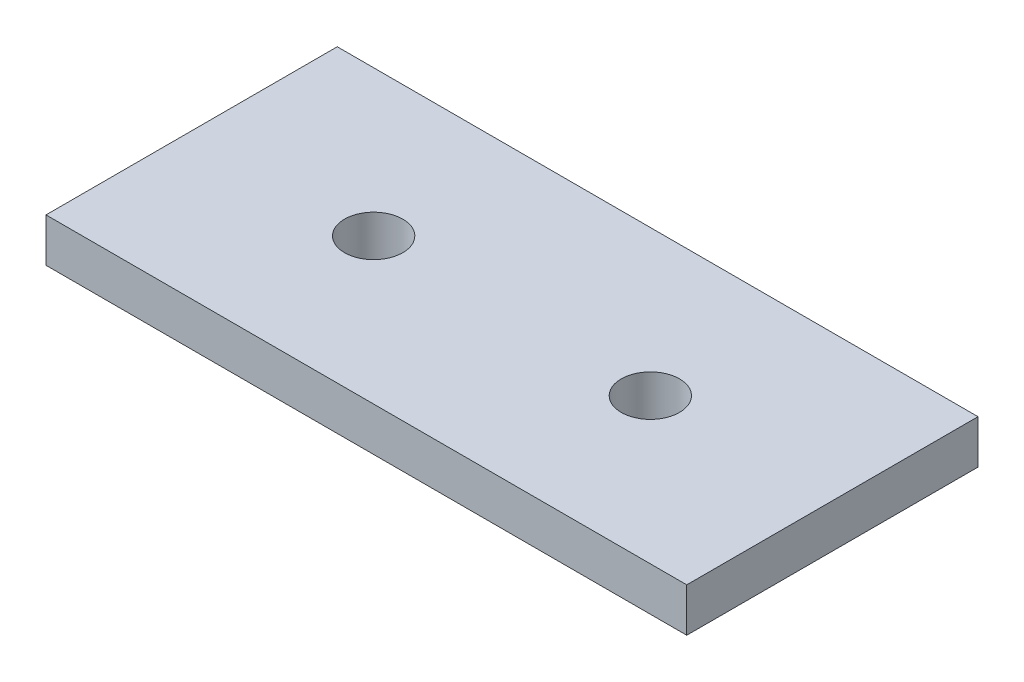
ISO-10303-21;
HEADER;
FILE_DESCRIPTION(('STEP AP214'),'2;1');
FILE_NAME('part.step','',(''),(''),'','','');
FILE_SCHEMA(('AUTOMOTIVE_DESIGN { 1 0 10303 214 1 1 1 1 }'));
ENDSEC;
DATA;
#1=APPLICATION_CONTEXT('core data for automotive mechanical design processes');
#2=APPLICATION_PROTOCOL_DEFINITION('international standard','automotive_design',2000,#1);
#3=PRODUCT_CONTEXT('',#1,'mechanical');
#4=PRODUCT('Part','Part','',(#3));
#5=PRODUCT_RELATED_PRODUCT_CATEGORY('part','',(#4));
#6=PRODUCT_DEFINITION_FORMATION('','',#4);
#7=PRODUCT_DEFINITION_CONTEXT('part definition',#1,'design');
#8=PRODUCT_DEFINITION('design','',#6,#7);
#9=PRODUCT_DEFINITION_SHAPE('','',#8);
#10=(LENGTH_UNIT() NAMED_UNIT(*) SI_UNIT(.MILLI.,.METRE.));
#11=(NAMED_UNIT(*) PLANE_ANGLE_UNIT() SI_UNIT($,.RADIAN.));
#12=(NAMED_UNIT(*) SI_UNIT($,.STERADIAN.) SOLID_ANGLE_UNIT());
#13=UNCERTAINTY_MEASURE_WITH_UNIT(LENGTH_MEASURE(1.E-05),#10,'distance_accuracy_value','');
#14=(GEOMETRIC_REPRESENTATION_CONTEXT(3) GLOBAL_UNCERTAINTY_ASSIGNED_CONTEXT((#13)) GLOBAL_UNIT_ASSIGNED_CONTEXT((#10,
#11,#12)) REPRESENTATION_CONTEXT('',''));
#15=CARTESIAN_POINT('',(0.,0.,0.));
#16=DIRECTION('',(0.,0.,1.));
#17=DIRECTION('',(1.,0.,0.));
#18=AXIS2_PLACEMENT_3D('',#15,#16,#17);
#19=CARTESIAN_POINT('',(-137.941176470588,6.,-9.55882352941175));
#20=DIRECTION('',(1.,0.,0.));
#21=DIRECTION('',(0.,0.,-1.));
#22=AXIS2_PLACEMENT_3D('',#19,#20,#21);
#23=PLANE('',#22);
#24=DIRECTION('',(0.,0.,1.));
#25=VECTOR('',#24,1.);
#26=CARTESIAN_POINT('',(-137.941176470588,0.,-9.55882352941175));
#27=LINE('',#26,#25);
#28=CARTESIAN_POINT('',(-137.941176470588,0.,-9.55882352941175));
#29=VERTEX_POINT('',#28);
#30=CARTESIAN_POINT('',(-137.941176470588,0.,30.4411764705882));
#31=VERTEX_POINT('',#30);
#32=EDGE_CURVE('E96',#29,#31,#27,.T.);
#33=ORIENTED_EDGE('',*,*,#32,.T.);
#34=DIRECTION('',(0.,-1.,0.));
#35=VECTOR('',#34,1.);
#36=CARTESIAN_POINT('',(-137.941176470588,6.,30.4411764705882));
#37=LINE('',#36,#35);
#38=CARTESIAN_POINT('',(-137.941176470588,6.,30.4411764705882));
#39=VERTEX_POINT('',#38);
#40=EDGE_CURVE('E11',#39,#31,#37,.T.);
#41=ORIENTED_EDGE('',*,*,#40,.F.);
#42=DIRECTION('',(0.,0.,1.));
#43=VECTOR('',#42,1.);
#44=CARTESIAN_POINT('',(-137.941176470588,6.,-9.55882352941175));
#45=LINE('',#44,#43);
#46=CARTESIAN_POINT('',(-137.941176470588,6.,-9.55882352941175));
#47=VERTEX_POINT('',#46);
#48=EDGE_CURVE('E84',#47,#39,#45,.T.);
#49=ORIENTED_EDGE('',*,*,#48,.F.);
#50=DIRECTION('',(0.,-1.,0.));
#51=VECTOR('',#50,1.);
#52=CARTESIAN_POINT('',(-137.941176470588,6.,-9.55882352941175));
#53=LINE('',#52,#51);
#54=EDGE_CURVE('E92',#47,#29,#53,.T.);
#55=ORIENTED_EDGE('',*,*,#54,.T.);
#56=EDGE_LOOP('',(#33,#41,#49,#55));
#57=FACE_BOUND('',#56,.T.);
#58=ADVANCED_FACE('F33',(#57),#23,.F.);
#59=CARTESIAN_POINT('',(-137.941176470588,6.,30.4411764705882));
#60=DIRECTION('',(0.,0.,-1.));
#61=DIRECTION('',(-1.,0.,0.));
#62=AXIS2_PLACEMENT_3D('',#59,#60,#61);
#63=PLANE('',#62);
#64=DIRECTION('',(1.,0.,0.));
#65=VECTOR('',#64,1.);
#66=CARTESIAN_POINT('',(-137.941176470588,0.,30.4411764705882));
#67=LINE('',#66,#65);
#68=CARTESIAN_POINT('',(-49.9411764705882,0.,30.4411764705883));
#69=VERTEX_POINT('',#68);
#70=EDGE_CURVE('E88',#31,#69,#67,.T.);
#71=ORIENTED_EDGE('',*,*,#70,.T.);
#72=DIRECTION('',(0.,-1.,0.));
#73=VECTOR('',#72,1.);
#74=CARTESIAN_POINT('',(-49.9411764705882,6.,30.4411764705883));
#75=LINE('',#74,#73);
#76=CARTESIAN_POINT('',(-49.9411764705882,6.,30.4411764705883));
#77=VERTEX_POINT('',#76);
#78=EDGE_CURVE('E41',#77,#69,#75,.T.);
#79=ORIENTED_EDGE('',*,*,#78,.F.);
#80=DIRECTION('',(1.,0.,0.));
#81=VECTOR('',#80,1.);
#82=CARTESIAN_POINT('',(-137.941176470588,6.,30.4411764705882));
#83=LINE('',#82,#81);
#84=EDGE_CURVE('E79',#39,#77,#83,.T.);
#85=ORIENTED_EDGE('',*,*,#84,.F.);
#86=ORIENTED_EDGE('',*,*,#40,.T.);
#87=EDGE_LOOP('',(#71,#79,#85,#86));
#88=FACE_BOUND('',#87,.T.);
#89=ADVANCED_FACE('F87',(#88),#63,.F.);
#90=CARTESIAN_POINT('',(-49.9411764705882,6.,-9.55882352941175));
#91=DIRECTION('',(-1.,0.,0.));
#92=DIRECTION('',(0.,0.,1.));
#93=AXIS2_PLACEMENT_3D('',#90,#91,#92);
#94=PLANE('',#93);
#95=DIRECTION('',(0.,0.,-1.));
#96=VECTOR('',#95,1.);
#97=CARTESIAN_POINT('',(-49.9411764705882,0.,-9.55882352941175));
#98=LINE('',#97,#96);
#99=CARTESIAN_POINT('',(-49.9411764705882,0.,-9.55882352941175));
#100=VERTEX_POINT('',#99);
#101=EDGE_CURVE('E66',#69,#100,#98,.T.);
#102=ORIENTED_EDGE('',*,*,#101,.T.);
#103=DIRECTION('',(0.,-1.,0.));
#104=VECTOR('',#103,1.);
#105=CARTESIAN_POINT('',(-49.9411764705882,6.,-9.55882352941175));
#106=LINE('',#105,#104);
#107=CARTESIAN_POINT('',(-49.9411764705882,6.,-9.55882352941175));
#108=VERTEX_POINT('',#107);
#109=EDGE_CURVE('E89',#108,#100,#106,.T.);
#110=ORIENTED_EDGE('',*,*,#109,.F.);
#111=DIRECTION('',(0.,0.,-1.));
#112=VECTOR('',#111,1.);
#113=CARTESIAN_POINT('',(-49.9411764705882,6.,-9.55882352941175));
#114=LINE('',#113,#112);
#115=EDGE_CURVE('E82',#77,#108,#114,.T.);
#116=ORIENTED_EDGE('',*,*,#115,.F.);
#117=ORIENTED_EDGE('',*,*,#78,.T.);
#118=EDGE_LOOP('',(#102,#110,#116,#117));
#119=FACE_BOUND('',#118,.T.);
#120=ADVANCED_FACE('F90',(#119),#94,.F.);
#121=CARTESIAN_POINT('',(-137.941176470588,6.,-9.55882352941175));
#122=DIRECTION('',(0.,0.,1.));
#123=DIRECTION('',(1.,0.,0.));
#124=AXIS2_PLACEMENT_3D('',#121,#122,#123);
#125=PLANE('',#124);
#126=DIRECTION('',(-1.,0.,0.));
#127=VECTOR('',#126,1.);
#128=CARTESIAN_POINT('',(-137.941176470588,0.,-9.55882352941175));
#129=LINE('',#128,#127);
#130=EDGE_CURVE('E72',#100,#29,#129,.T.);
#131=ORIENTED_EDGE('',*,*,#130,.T.);
#132=ORIENTED_EDGE('',*,*,#54,.F.);
#133=DIRECTION('',(-1.,0.,0.));
#134=VECTOR('',#133,1.);
#135=CARTESIAN_POINT('',(-137.941176470588,6.,-9.55882352941175));
#136=LINE('',#135,#134);
#137=EDGE_CURVE('E49',#108,#47,#136,.T.);
#138=ORIENTED_EDGE('',*,*,#137,.F.);
#139=ORIENTED_EDGE('',*,*,#109,.T.);
#140=EDGE_LOOP('',(#131,#132,#138,#139));
#141=FACE_BOUND('',#140,.T.);
#142=ADVANCED_FACE('F104',(#141),#125,.F.);
#143=CARTESIAN_POINT('',(0.,6.,0.));
#144=DIRECTION('',(0.,1.,0.));
#145=DIRECTION('',(0.,0.,1.));
#146=AXIS2_PLACEMENT_3D('',#143,#144,#145);
#147=PLANE('',#146);
#148=CARTESIAN_POINT('',(-74.9411764705882,6.,10.4411764705883));
#149=DIRECTION('',(0.,-1.,0.));
#150=DIRECTION('',(0.,0.,-1.));
#151=AXIS2_PLACEMENT_3D('',#148,#149,#150);
#152=CIRCLE('',#151,4.00000000000001);
#153=CARTESIAN_POINT('',(-74.9411764705882,6.,6.44117647058828));
#154=VERTEX_POINT('',#153);
#155=EDGE_CURVE('E99',#154,#154,#152,.T.);
#156=ORIENTED_EDGE('',*,*,#155,.T.);
#157=EDGE_LOOP('',(#156));
#158=FACE_BOUND('',#157,.T.);
#159=CARTESIAN_POINT('',(-112.941176470588,6.,10.4411764705883));
#160=DIRECTION('',(0.,-1.,0.));
#161=DIRECTION('',(0.,0.,-1.));
#162=AXIS2_PLACEMENT_3D('',#159,#160,#161);
#163=CIRCLE('',#162,4.00000000000001);
#164=CARTESIAN_POINT('',(-112.941176470588,6.,6.44117647058828));
#165=VERTEX_POINT('',#164);
#166=EDGE_CURVE('E113',#165,#165,#163,.T.);
#167=ORIENTED_EDGE('',*,*,#166,.T.);
#168=EDGE_LOOP('',(#167));
#169=FACE_BOUND('',#168,.T.);
#170=ORIENTED_EDGE('',*,*,#48,.T.);
#171=ORIENTED_EDGE('',*,*,#84,.T.);
#172=ORIENTED_EDGE('',*,*,#115,.T.);
#173=ORIENTED_EDGE('',*,*,#137,.T.);
#174=EDGE_LOOP('',(#170,#171,#172,#173));
#175=FACE_BOUND('',#174,.T.);
#176=ADVANCED_FACE('F80',(#158,#169,#175),#147,.T.);
#177=CARTESIAN_POINT('',(0.,0.,0.));
#178=DIRECTION('',(0.,1.,0.));
#179=DIRECTION('',(0.,0.,1.));
#180=AXIS2_PLACEMENT_3D('',#177,#178,#179);
#181=PLANE('',#180);
#182=CARTESIAN_POINT('',(-74.9411764705882,0.,10.4411764705883));
#183=DIRECTION('',(0.,-1.,0.));
#184=DIRECTION('',(0.,0.,-1.));
#185=AXIS2_PLACEMENT_3D('',#182,#183,#184);
#186=CIRCLE('',#185,4.00000000000001);
#187=CARTESIAN_POINT('',(-74.9411764705882,0.,6.44117647058828));
#188=VERTEX_POINT('',#187);
#189=EDGE_CURVE('E116',#188,#188,#186,.T.);
#190=ORIENTED_EDGE('',*,*,#189,.F.);
#191=EDGE_LOOP('',(#190));
#192=FACE_BOUND('',#191,.T.);
#193=CARTESIAN_POINT('',(-112.941176470588,0.,10.4411764705883));
#194=DIRECTION('',(0.,-1.,0.));
#195=DIRECTION('',(0.,0.,-1.));
#196=AXIS2_PLACEMENT_3D('',#193,#194,#195);
#197=CIRCLE('',#196,4.00000000000001);
#198=CARTESIAN_POINT('',(-112.941176470588,0.,6.44117647058828));
#199=VERTEX_POINT('',#198);
#200=EDGE_CURVE('E110',#199,#199,#197,.T.);
#201=ORIENTED_EDGE('',*,*,#200,.F.);
#202=EDGE_LOOP('',(#201));
#203=FACE_BOUND('',#202,.T.);
#204=ORIENTED_EDGE('',*,*,#32,.F.);
#205=ORIENTED_EDGE('',*,*,#130,.F.);
#206=ORIENTED_EDGE('',*,*,#101,.F.);
#207=ORIENTED_EDGE('',*,*,#70,.F.);
#208=EDGE_LOOP('',(#204,#205,#206,#207));
#209=FACE_BOUND('',#208,.T.);
#210=ADVANCED_FACE('F107',(#192,#203,#209),#181,.F.);
#211=CARTESIAN_POINT('',(-112.941176470588,6.,10.4411764705883));
#212=DIRECTION('',(0.,-1.,0.));
#213=DIRECTION('',(0.,0.,-1.));
#214=AXIS2_PLACEMENT_3D('',#211,#212,#213);
#215=CYLINDRICAL_SURFACE('',#214,4.00000000000001);
#216=ORIENTED_EDGE('',*,*,#166,.F.);
#217=EDGE_LOOP('',(#216));
#218=FACE_BOUND('',#217,.T.);
#219=ORIENTED_EDGE('',*,*,#200,.T.);
#220=EDGE_LOOP('',(#219));
#221=FACE_BOUND('',#220,.T.);
#222=ADVANCED_FACE('F127',(#218,#221),#215,.F.);
#223=CARTESIAN_POINT('',(-74.9411764705882,6.,10.4411764705883));
#224=DIRECTION('',(0.,-1.,0.));
#225=DIRECTION('',(0.,0.,-1.));
#226=AXIS2_PLACEMENT_3D('',#223,#224,#225);
#227=CYLINDRICAL_SURFACE('',#226,4.00000000000001);
#228=ORIENTED_EDGE('',*,*,#155,.F.);
#229=EDGE_LOOP('',(#228));
#230=FACE_BOUND('',#229,.T.);
#231=ORIENTED_EDGE('',*,*,#189,.T.);
#232=EDGE_LOOP('',(#231));
#233=FACE_BOUND('',#232,.T.);
#234=ADVANCED_FACE('F124',(#230,#233),#227,.F.);
#235=CLOSED_SHELL('',(#58,#89,#120,#142,#176,#210,#222,#234));
#236=MANIFOLD_SOLID_BREP('B2',#235);
#237=ADVANCED_BREP_SHAPE_REPRESENTATION('',(#18,#236),#14);
#238=SHAPE_DEFINITION_REPRESENTATION(#9,#237);
ENDSEC;
END-ISO-10303-21;
